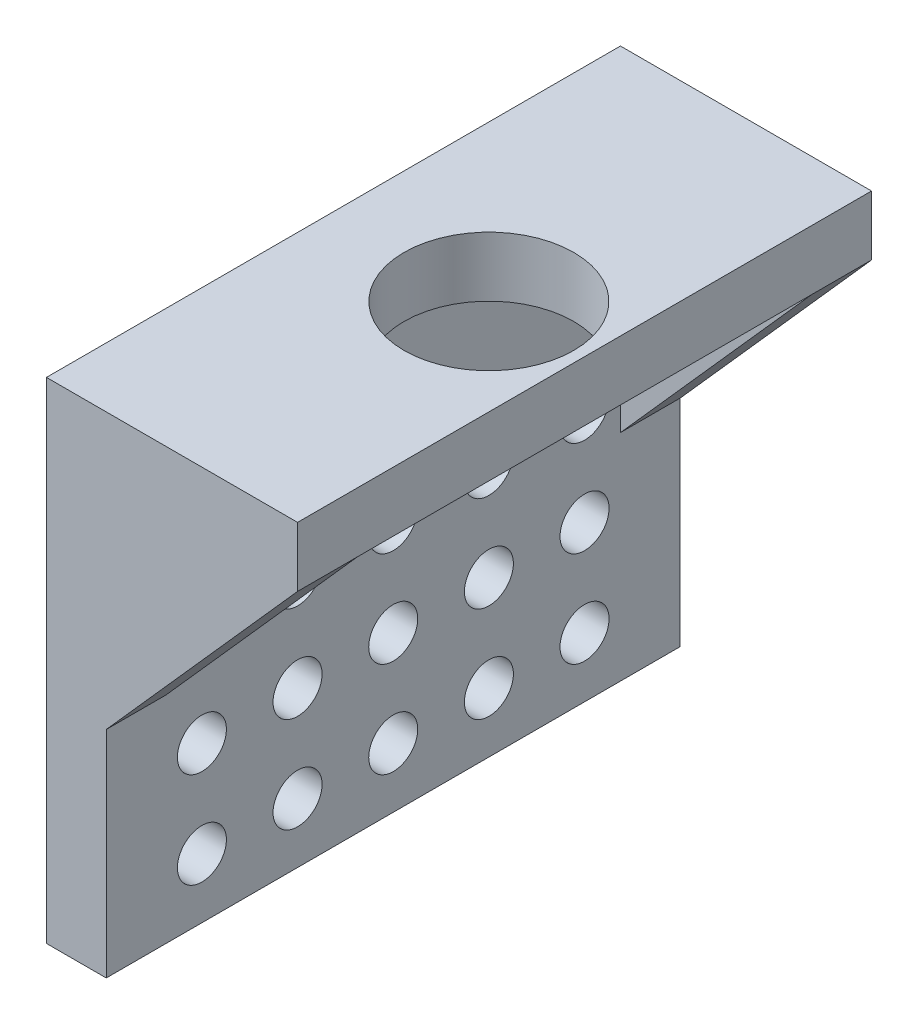
ISO-10303-21;
HEADER;
FILE_DESCRIPTION(('STEP AP214'),'2;1');
FILE_NAME('part.step','',(''),(''),'','','');
FILE_SCHEMA(('AUTOMOTIVE_DESIGN { 1 0 10303 214 1 1 1 1 }'));
ENDSEC;
DATA;
#1=APPLICATION_CONTEXT('core data for automotive mechanical design processes');
#2=APPLICATION_PROTOCOL_DEFINITION('international standard','automotive_design',2000,#1);
#3=PRODUCT_CONTEXT('',#1,'mechanical');
#4=PRODUCT('Part','Part','',(#3));
#5=PRODUCT_RELATED_PRODUCT_CATEGORY('part','',(#4));
#6=PRODUCT_DEFINITION_FORMATION('','',#4);
#7=PRODUCT_DEFINITION_CONTEXT('part definition',#1,'design');
#8=PRODUCT_DEFINITION('design','',#6,#7);
#9=PRODUCT_DEFINITION_SHAPE('','',#8);
#10=(LENGTH_UNIT() NAMED_UNIT(*) SI_UNIT(.MILLI.,.METRE.));
#11=(NAMED_UNIT(*) PLANE_ANGLE_UNIT() SI_UNIT($,.RADIAN.));
#12=(NAMED_UNIT(*) SI_UNIT($,.STERADIAN.) SOLID_ANGLE_UNIT());
#13=UNCERTAINTY_MEASURE_WITH_UNIT(LENGTH_MEASURE(1.E-05),#10,'distance_accuracy_value','');
#14=(GEOMETRIC_REPRESENTATION_CONTEXT(3) GLOBAL_UNCERTAINTY_ASSIGNED_CONTEXT((#13)) GLOBAL_UNIT_ASSIGNED_CONTEXT((#10,
#11,#12)) REPRESENTATION_CONTEXT('',''));
#15=CARTESIAN_POINT('',(0.,0.,0.));
#16=DIRECTION('',(0.,0.,1.));
#17=DIRECTION('',(1.,0.,0.));
#18=AXIS2_PLACEMENT_3D('',#15,#16,#17);
#19=CARTESIAN_POINT('',(0.,0.,0.));
#20=DIRECTION('',(0.,-1.,0.));
#21=DIRECTION('',(0.,0.,-1.));
#22=AXIS2_PLACEMENT_3D('',#19,#20,#21);
#23=PLANE('',#22);
#24=CARTESIAN_POINT('',(13.,0.,24.));
#25=DIRECTION('',(0.,1.,0.));
#26=DIRECTION('',(0.,0.,1.));
#27=AXIS2_PLACEMENT_3D('',#24,#25,#26);
#28=CIRCLE('',#27,7.1);
#29=CARTESIAN_POINT('',(13.,0.,31.1));
#30=VERTEX_POINT('',#29);
#31=EDGE_CURVE('E164',#30,#30,#28,.T.);
#32=ORIENTED_EDGE('',*,*,#31,.T.);
#33=EDGE_LOOP('',(#32));
#34=FACE_BOUND('',#33,.T.);
#35=DIRECTION('',(0.,0.,1.));
#36=VECTOR('',#35,1.);
#37=CARTESIAN_POINT('',(5.,0.,48.));
#38=LINE('',#37,#36);
#39=CARTESIAN_POINT('',(5.,0.,5.));
#40=VERTEX_POINT('',#39);
#41=CARTESIAN_POINT('',(5.,0.,43.));
#42=VERTEX_POINT('',#41);
#43=EDGE_CURVE('E63',#40,#42,#38,.T.);
#44=ORIENTED_EDGE('',*,*,#43,.F.);
#45=DIRECTION('',(-1.,0.,0.));
#46=VECTOR('',#45,1.);
#47=CARTESIAN_POINT('',(21.,0.,5.));
#48=LINE('',#47,#46);
#49=CARTESIAN_POINT('',(21.,0.,5.));
#50=VERTEX_POINT('',#49);
#51=EDGE_CURVE('E208',#50,#40,#48,.T.);
#52=ORIENTED_EDGE('',*,*,#51,.F.);
#53=DIRECTION('',(0.,0.,-1.));
#54=VECTOR('',#53,1.);
#55=CARTESIAN_POINT('',(21.,0.,0.));
#56=LINE('',#55,#54);
#57=CARTESIAN_POINT('',(21.,0.,43.));
#58=VERTEX_POINT('',#57);
#59=EDGE_CURVE('E135',#58,#50,#56,.T.);
#60=ORIENTED_EDGE('',*,*,#59,.F.);
#61=DIRECTION('',(1.,0.,0.));
#62=VECTOR('',#61,1.);
#63=CARTESIAN_POINT('',(21.,0.,43.));
#64=LINE('',#63,#62);
#65=EDGE_CURVE('E199',#42,#58,#64,.T.);
#66=ORIENTED_EDGE('',*,*,#65,.F.);
#67=EDGE_LOOP('',(#44,#52,#60,#66));
#68=FACE_BOUND('',#67,.T.);
#69=ADVANCED_FACE('F39',(#34,#68),#23,.T.);
#70=CARTESIAN_POINT('',(5.,-36.,48.));
#71=DIRECTION('',(-1.,0.,0.));
#72=DIRECTION('',(0.,0.,1.));
#73=AXIS2_PLACEMENT_3D('',#70,#71,#72);
#74=PLANE('',#73);
#75=CARTESIAN_POINT('',(5.00000000000001,-31.,16.));
#76=DIRECTION('',(-1.,0.,0.));
#77=DIRECTION('',(0.,0.,1.));
#78=AXIS2_PLACEMENT_3D('',#75,#76,#77);
#79=CIRCLE('',#78,2.05);
#80=CARTESIAN_POINT('',(5.00000000000001,-31.,18.05));
#81=VERTEX_POINT('',#80);
#82=EDGE_CURVE('E220',#81,#81,#79,.T.);
#83=ORIENTED_EDGE('',*,*,#82,.T.);
#84=EDGE_LOOP('',(#83));
#85=FACE_BOUND('',#84,.T.);
#86=CARTESIAN_POINT('',(5.,-31.,24.));
#87=DIRECTION('',(-1.,0.,0.));
#88=DIRECTION('',(0.,0.,1.));
#89=AXIS2_PLACEMENT_3D('',#86,#87,#88);
#90=CIRCLE('',#89,2.05);
#91=CARTESIAN_POINT('',(5.,-31.,26.05));
#92=VERTEX_POINT('',#91);
#93=EDGE_CURVE('E225',#92,#92,#90,.T.);
#94=ORIENTED_EDGE('',*,*,#93,.T.);
#95=EDGE_LOOP('',(#94));
#96=FACE_BOUND('',#95,.T.);
#97=CARTESIAN_POINT('',(5.,-31.,32.));
#98=DIRECTION('',(-1.,0.,0.));
#99=DIRECTION('',(0.,0.,1.));
#100=AXIS2_PLACEMENT_3D('',#97,#98,#99);
#101=CIRCLE('',#100,2.05);
#102=CARTESIAN_POINT('',(5.,-31.,34.05));
#103=VERTEX_POINT('',#102);
#104=EDGE_CURVE('E229',#103,#103,#101,.T.);
#105=ORIENTED_EDGE('',*,*,#104,.T.);
#106=EDGE_LOOP('',(#105));
#107=FACE_BOUND('',#106,.T.);
#108=CARTESIAN_POINT('',(5.,-31.,40.));
#109=DIRECTION('',(-1.,0.,0.));
#110=DIRECTION('',(0.,0.,1.));
#111=AXIS2_PLACEMENT_3D('',#108,#109,#110);
#112=CIRCLE('',#111,2.05);
#113=CARTESIAN_POINT('',(5.,-31.,42.05));
#114=VERTEX_POINT('',#113);
#115=EDGE_CURVE('E233',#114,#114,#112,.T.);
#116=ORIENTED_EDGE('',*,*,#115,.T.);
#117=EDGE_LOOP('',(#116));
#118=FACE_BOUND('',#117,.T.);
#119=CARTESIAN_POINT('',(5.00000000000001,-23.,16.));
#120=DIRECTION('',(-1.,0.,0.));
#121=DIRECTION('',(0.,0.,1.));
#122=AXIS2_PLACEMENT_3D('',#119,#120,#121);
#123=CIRCLE('',#122,2.05);
#124=CARTESIAN_POINT('',(5.00000000000001,-23.,18.05));
#125=VERTEX_POINT('',#124);
#126=EDGE_CURVE('E237',#125,#125,#123,.T.);
#127=ORIENTED_EDGE('',*,*,#126,.T.);
#128=EDGE_LOOP('',(#127));
#129=FACE_BOUND('',#128,.T.);
#130=CARTESIAN_POINT('',(5.,-23.,24.));
#131=DIRECTION('',(-1.,0.,0.));
#132=DIRECTION('',(0.,0.,1.));
#133=AXIS2_PLACEMENT_3D('',#130,#131,#132);
#134=CIRCLE('',#133,2.05);
#135=CARTESIAN_POINT('',(5.,-23.,26.05));
#136=VERTEX_POINT('',#135);
#137=EDGE_CURVE('E241',#136,#136,#134,.T.);
#138=ORIENTED_EDGE('',*,*,#137,.T.);
#139=EDGE_LOOP('',(#138));
#140=FACE_BOUND('',#139,.T.);
#141=CARTESIAN_POINT('',(5.,-23.,32.));
#142=DIRECTION('',(-1.,0.,0.));
#143=DIRECTION('',(0.,0.,1.));
#144=AXIS2_PLACEMENT_3D('',#141,#142,#143);
#145=CIRCLE('',#144,2.05);
#146=CARTESIAN_POINT('',(5.,-23.,34.05));
#147=VERTEX_POINT('',#146);
#148=EDGE_CURVE('E245',#147,#147,#145,.T.);
#149=ORIENTED_EDGE('',*,*,#148,.T.);
#150=EDGE_LOOP('',(#149));
#151=FACE_BOUND('',#150,.T.);
#152=CARTESIAN_POINT('',(5.,-23.,40.));
#153=DIRECTION('',(-1.,0.,0.));
#154=DIRECTION('',(0.,0.,1.));
#155=AXIS2_PLACEMENT_3D('',#152,#153,#154);
#156=CIRCLE('',#155,2.05);
#157=CARTESIAN_POINT('',(5.,-23.,42.05));
#158=VERTEX_POINT('',#157);
#159=EDGE_CURVE('E249',#158,#158,#156,.T.);
#160=ORIENTED_EDGE('',*,*,#159,.T.);
#161=EDGE_LOOP('',(#160));
#162=FACE_BOUND('',#161,.T.);
#163=CARTESIAN_POINT('',(5.00000000000001,-15.,16.));
#164=DIRECTION('',(-1.,0.,0.));
#165=DIRECTION('',(0.,0.,1.));
#166=AXIS2_PLACEMENT_3D('',#163,#164,#165);
#167=CIRCLE('',#166,2.05);
#168=CARTESIAN_POINT('',(5.00000000000001,-15.,18.05));
#169=VERTEX_POINT('',#168);
#170=EDGE_CURVE('E253',#169,#169,#167,.T.);
#171=ORIENTED_EDGE('',*,*,#170,.T.);
#172=EDGE_LOOP('',(#171));
#173=FACE_BOUND('',#172,.T.);
#174=CARTESIAN_POINT('',(5.,-15.,24.));
#175=DIRECTION('',(-1.,0.,0.));
#176=DIRECTION('',(0.,0.,1.));
#177=AXIS2_PLACEMENT_3D('',#174,#175,#176);
#178=CIRCLE('',#177,2.05);
#179=CARTESIAN_POINT('',(5.,-15.,26.05));
#180=VERTEX_POINT('',#179);
#181=EDGE_CURVE('E257',#180,#180,#178,.T.);
#182=ORIENTED_EDGE('',*,*,#181,.T.);
#183=EDGE_LOOP('',(#182));
#184=FACE_BOUND('',#183,.T.);
#185=CARTESIAN_POINT('',(5.,-15.,32.));
#186=DIRECTION('',(-1.,0.,0.));
#187=DIRECTION('',(0.,0.,1.));
#188=AXIS2_PLACEMENT_3D('',#185,#186,#187);
#189=CIRCLE('',#188,2.05);
#190=CARTESIAN_POINT('',(5.,-15.,34.05));
#191=VERTEX_POINT('',#190);
#192=EDGE_CURVE('E261',#191,#191,#189,.T.);
#193=ORIENTED_EDGE('',*,*,#192,.T.);
#194=EDGE_LOOP('',(#193));
#195=FACE_BOUND('',#194,.T.);
#196=CARTESIAN_POINT('',(5.,-15.,40.));
#197=DIRECTION('',(-1.,0.,0.));
#198=DIRECTION('',(0.,0.,1.));
#199=AXIS2_PLACEMENT_3D('',#196,#197,#198);
#200=CIRCLE('',#199,2.05);
#201=CARTESIAN_POINT('',(5.,-15.,42.05));
#202=VERTEX_POINT('',#201);
#203=EDGE_CURVE('E265',#202,#202,#200,.T.);
#204=ORIENTED_EDGE('',*,*,#203,.T.);
#205=EDGE_LOOP('',(#204));
#206=FACE_BOUND('',#205,.T.);
#207=CARTESIAN_POINT('',(5.00000000000001,-23.,7.99999999999998));
#208=DIRECTION('',(-1.,0.,0.));
#209=DIRECTION('',(0.,0.,1.));
#210=AXIS2_PLACEMENT_3D('',#207,#208,#209);
#211=CIRCLE('',#210,2.05);
#212=CARTESIAN_POINT('',(5.00000000000001,-23.,10.05));
#213=VERTEX_POINT('',#212);
#214=EDGE_CURVE('E269',#213,#213,#211,.T.);
#215=ORIENTED_EDGE('',*,*,#214,.T.);
#216=EDGE_LOOP('',(#215));
#217=FACE_BOUND('',#216,.T.);
#218=CARTESIAN_POINT('',(5.00000000000001,-15.,7.99999999999995));
#219=DIRECTION('',(-1.,0.,0.));
#220=DIRECTION('',(0.,0.,1.));
#221=AXIS2_PLACEMENT_3D('',#218,#219,#220);
#222=CIRCLE('',#221,2.05);
#223=CARTESIAN_POINT('',(5.00000000000001,-15.,10.05));
#224=VERTEX_POINT('',#223);
#225=EDGE_CURVE('E273',#224,#224,#222,.T.);
#226=ORIENTED_EDGE('',*,*,#225,.T.);
#227=EDGE_LOOP('',(#226));
#228=FACE_BOUND('',#227,.T.);
#229=CARTESIAN_POINT('',(5.00000000000001,-31.,8.00000000000001));
#230=DIRECTION('',(-1.,0.,0.));
#231=DIRECTION('',(0.,0.,1.));
#232=AXIS2_PLACEMENT_3D('',#229,#230,#231);
#233=CIRCLE('',#232,2.05);
#234=CARTESIAN_POINT('',(5.00000000000001,-31.,10.05));
#235=VERTEX_POINT('',#234);
#236=EDGE_CURVE('E277',#235,#235,#233,.T.);
#237=ORIENTED_EDGE('',*,*,#236,.T.);
#238=EDGE_LOOP('',(#237));
#239=FACE_BOUND('',#238,.T.);
#240=DIRECTION('',(0.,1.,0.));
#241=VECTOR('',#240,1.);
#242=CARTESIAN_POINT('',(5.,-18.,43.));
#243=LINE('',#242,#241);
#244=CARTESIAN_POINT('',(5.,-18.,43.));
#245=VERTEX_POINT('',#244);
#246=EDGE_CURVE('E182',#245,#42,#243,.T.);
#247=ORIENTED_EDGE('',*,*,#246,.F.);
#248=DIRECTION('',(0.,0.,-1.));
#249=VECTOR('',#248,1.);
#250=CARTESIAN_POINT('',(5.,-18.,43.));
#251=LINE('',#250,#249);
#252=CARTESIAN_POINT('',(5.,-18.,48.));
#253=VERTEX_POINT('',#252);
#254=EDGE_CURVE('E198',#253,#245,#251,.T.);
#255=ORIENTED_EDGE('',*,*,#254,.F.);
#256=DIRECTION('',(0.,1.,0.));
#257=VECTOR('',#256,1.);
#258=CARTESIAN_POINT('',(5.,-36.,48.));
#259=LINE('',#258,#257);
#260=CARTESIAN_POINT('',(5.,-36.,48.));
#261=VERTEX_POINT('',#260);
#262=EDGE_CURVE('E174',#261,#253,#259,.T.);
#263=ORIENTED_EDGE('',*,*,#262,.F.);
#264=DIRECTION('',(0.,0.,1.));
#265=VECTOR('',#264,1.);
#266=CARTESIAN_POINT('',(5.,-36.,48.));
#267=LINE('',#266,#265);
#268=CARTESIAN_POINT('',(5.00000000000001,-36.,0.));
#269=VERTEX_POINT('',#268);
#270=EDGE_CURVE('E186',#269,#261,#267,.T.);
#271=ORIENTED_EDGE('',*,*,#270,.F.);
#272=DIRECTION('',(0.,1.,0.));
#273=VECTOR('',#272,1.);
#274=CARTESIAN_POINT('',(5.00000000000001,-36.,0.));
#275=LINE('',#274,#273);
#276=CARTESIAN_POINT('',(5.,-18.,0.));
#277=VERTEX_POINT('',#276);
#278=EDGE_CURVE('E168',#269,#277,#275,.T.);
#279=ORIENTED_EDGE('',*,*,#278,.T.);
#280=DIRECTION('',(0.,0.,-1.));
#281=VECTOR('',#280,1.);
#282=CARTESIAN_POINT('',(5.,-18.,5.));
#283=LINE('',#282,#281);
#284=CARTESIAN_POINT('',(5.,-18.,5.));
#285=VERTEX_POINT('',#284);
#286=EDGE_CURVE('E117',#285,#277,#283,.T.);
#287=ORIENTED_EDGE('',*,*,#286,.F.);
#288=DIRECTION('',(0.,1.,0.));
#289=VECTOR('',#288,1.);
#290=CARTESIAN_POINT('',(5.,-18.,5.));
#291=LINE('',#290,#289);
#292=EDGE_CURVE('E203',#285,#40,#291,.T.);
#293=ORIENTED_EDGE('',*,*,#292,.T.);
#294=ORIENTED_EDGE('',*,*,#43,.T.);
#295=EDGE_LOOP('',(#247,#255,#263,#271,#279,#287,#293,#294));
#296=FACE_BOUND('',#295,.T.);
#297=ADVANCED_FACE('F380',(#85,#96,#107,#118,#129,#140,#151,#162,#173,#184,#195,#206,#217,#228,
#239,#296),#74,.F.);
#298=CARTESIAN_POINT('',(0.,5.,0.));
#299=DIRECTION('',(0.,-1.,0.));
#300=DIRECTION('',(0.,0.,-1.));
#301=AXIS2_PLACEMENT_3D('',#298,#299,#300);
#302=PLANE('',#301);
#303=DIRECTION('',(0.,0.,1.));
#304=VECTOR('',#303,1.);
#305=CARTESIAN_POINT('',(0.,5.,48.));
#306=LINE('',#305,#304);
#307=CARTESIAN_POINT('',(0.,5.,0.));
#308=VERTEX_POINT('',#307);
#309=CARTESIAN_POINT('',(0.,5.,48.));
#310=VERTEX_POINT('',#309);
#311=EDGE_CURVE('E151',#308,#310,#306,.T.);
#312=ORIENTED_EDGE('',*,*,#311,.T.);
#313=DIRECTION('',(1.,0.,0.));
#314=VECTOR('',#313,1.);
#315=CARTESIAN_POINT('',(21.,5.,48.));
#316=LINE('',#315,#314);
#317=CARTESIAN_POINT('',(21.,5.,48.));
#318=VERTEX_POINT('',#317);
#319=EDGE_CURVE('E158',#310,#318,#316,.T.);
#320=ORIENTED_EDGE('',*,*,#319,.T.);
#321=DIRECTION('',(0.,0.,-1.));
#322=VECTOR('',#321,1.);
#323=CARTESIAN_POINT('',(21.,5.,0.));
#324=LINE('',#323,#322);
#325=CARTESIAN_POINT('',(21.,5.,0.));
#326=VERTEX_POINT('',#325);
#327=EDGE_CURVE('E155',#318,#326,#324,.T.);
#328=ORIENTED_EDGE('',*,*,#327,.T.);
#329=DIRECTION('',(-1.,0.,0.));
#330=VECTOR('',#329,1.);
#331=CARTESIAN_POINT('',(0.,5.,0.));
#332=LINE('',#331,#330);
#333=EDGE_CURVE('E141',#326,#308,#332,.T.);
#334=ORIENTED_EDGE('',*,*,#333,.T.);
#335=EDGE_LOOP('',(#312,#320,#328,#334));
#336=FACE_BOUND('',#335,.T.);
#337=CARTESIAN_POINT('',(13.,5.,24.));
#338=DIRECTION('',(0.,1.,0.));
#339=DIRECTION('',(0.,0.,1.));
#340=AXIS2_PLACEMENT_3D('',#337,#338,#339);
#341=CIRCLE('',#340,7.1);
#342=CARTESIAN_POINT('',(13.,5.,31.1));
#343=VERTEX_POINT('',#342);
#344=EDGE_CURVE('E152',#343,#343,#341,.T.);
#345=ORIENTED_EDGE('',*,*,#344,.F.);
#346=EDGE_LOOP('',(#345));
#347=FACE_BOUND('',#346,.T.);
#348=ADVANCED_FACE('F348',(#336,#347),#302,.F.);
#349=CARTESIAN_POINT('',(0.,5.,48.));
#350=DIRECTION('',(1.,0.,0.));
#351=DIRECTION('',(0.,0.,-1.));
#352=AXIS2_PLACEMENT_3D('',#349,#350,#351);
#353=PLANE('',#352);
#354=CARTESIAN_POINT('',(0.,-31.,16.));
#355=DIRECTION('',(-1.,0.,0.));
#356=DIRECTION('',(0.,0.,1.));
#357=AXIS2_PLACEMENT_3D('',#354,#355,#356);
#358=CIRCLE('',#357,2.05);
#359=CARTESIAN_POINT('',(0.,-31.,18.05));
#360=VERTEX_POINT('',#359);
#361=EDGE_CURVE('E285',#360,#360,#358,.T.);
#362=ORIENTED_EDGE('',*,*,#361,.F.);
#363=EDGE_LOOP('',(#362));
#364=FACE_BOUND('',#363,.T.);
#365=CARTESIAN_POINT('',(0.,-31.,24.));
#366=DIRECTION('',(-1.,0.,0.));
#367=DIRECTION('',(0.,0.,1.));
#368=AXIS2_PLACEMENT_3D('',#365,#366,#367);
#369=CIRCLE('',#368,2.05);
#370=CARTESIAN_POINT('',(0.,-31.,26.05));
#371=VERTEX_POINT('',#370);
#372=EDGE_CURVE('E311',#371,#371,#369,.T.);
#373=ORIENTED_EDGE('',*,*,#372,.F.);
#374=EDGE_LOOP('',(#373));
#375=FACE_BOUND('',#374,.T.);
#376=CARTESIAN_POINT('',(0.,-31.,32.));
#377=DIRECTION('',(-1.,0.,0.));
#378=DIRECTION('',(0.,0.,1.));
#379=AXIS2_PLACEMENT_3D('',#376,#377,#378);
#380=CIRCLE('',#379,2.05);
#381=CARTESIAN_POINT('',(0.,-31.,34.05));
#382=VERTEX_POINT('',#381);
#383=EDGE_CURVE('E307',#382,#382,#380,.T.);
#384=ORIENTED_EDGE('',*,*,#383,.F.);
#385=EDGE_LOOP('',(#384));
#386=FACE_BOUND('',#385,.T.);
#387=CARTESIAN_POINT('',(0.,-31.,40.));
#388=DIRECTION('',(-1.,0.,0.));
#389=DIRECTION('',(0.,0.,1.));
#390=AXIS2_PLACEMENT_3D('',#387,#388,#389);
#391=CIRCLE('',#390,2.05);
#392=CARTESIAN_POINT('',(0.,-31.,42.05));
#393=VERTEX_POINT('',#392);
#394=EDGE_CURVE('E303',#393,#393,#391,.T.);
#395=ORIENTED_EDGE('',*,*,#394,.F.);
#396=EDGE_LOOP('',(#395));
#397=FACE_BOUND('',#396,.T.);
#398=CARTESIAN_POINT('',(0.,-23.,16.));
#399=DIRECTION('',(-1.,0.,0.));
#400=DIRECTION('',(0.,0.,1.));
#401=AXIS2_PLACEMENT_3D('',#398,#399,#400);
#402=CIRCLE('',#401,2.05);
#403=CARTESIAN_POINT('',(0.,-23.,18.05));
#404=VERTEX_POINT('',#403);
#405=EDGE_CURVE('E299',#404,#404,#402,.T.);
#406=ORIENTED_EDGE('',*,*,#405,.F.);
#407=EDGE_LOOP('',(#406));
#408=FACE_BOUND('',#407,.T.);
#409=CARTESIAN_POINT('',(0.,-23.,24.));
#410=DIRECTION('',(-1.,0.,0.));
#411=DIRECTION('',(0.,0.,1.));
#412=AXIS2_PLACEMENT_3D('',#409,#410,#411);
#413=CIRCLE('',#412,2.05);
#414=CARTESIAN_POINT('',(0.,-23.,26.05));
#415=VERTEX_POINT('',#414);
#416=EDGE_CURVE('E295',#415,#415,#413,.T.);
#417=ORIENTED_EDGE('',*,*,#416,.F.);
#418=EDGE_LOOP('',(#417));
#419=FACE_BOUND('',#418,.T.);
#420=CARTESIAN_POINT('',(0.,-23.,32.));
#421=DIRECTION('',(-1.,0.,0.));
#422=DIRECTION('',(0.,0.,1.));
#423=AXIS2_PLACEMENT_3D('',#420,#421,#422);
#424=CIRCLE('',#423,2.05);
#425=CARTESIAN_POINT('',(0.,-23.,34.05));
#426=VERTEX_POINT('',#425);
#427=EDGE_CURVE('E290',#426,#426,#424,.T.);
#428=ORIENTED_EDGE('',*,*,#427,.F.);
#429=EDGE_LOOP('',(#428));
#430=FACE_BOUND('',#429,.T.);
#431=CARTESIAN_POINT('',(0.,-23.,40.));
#432=DIRECTION('',(-1.,0.,0.));
#433=DIRECTION('',(0.,0.,1.));
#434=AXIS2_PLACEMENT_3D('',#431,#432,#433);
#435=CIRCLE('',#434,2.05);
#436=CARTESIAN_POINT('',(0.,-23.,42.05));
#437=VERTEX_POINT('',#436);
#438=EDGE_CURVE('E286',#437,#437,#435,.T.);
#439=ORIENTED_EDGE('',*,*,#438,.F.);
#440=EDGE_LOOP('',(#439));
#441=FACE_BOUND('',#440,.T.);
#442=CARTESIAN_POINT('',(0.,-15.,16.));
#443=DIRECTION('',(-1.,0.,0.));
#444=DIRECTION('',(0.,0.,1.));
#445=AXIS2_PLACEMENT_3D('',#442,#443,#444);
#446=CIRCLE('',#445,2.05);
#447=CARTESIAN_POINT('',(0.,-15.,18.05));
#448=VERTEX_POINT('',#447);
#449=EDGE_CURVE('E291',#448,#448,#446,.T.);
#450=ORIENTED_EDGE('',*,*,#449,.F.);
#451=EDGE_LOOP('',(#450));
#452=FACE_BOUND('',#451,.T.);
#453=CARTESIAN_POINT('',(0.,-15.,24.));
#454=DIRECTION('',(-1.,0.,0.));
#455=DIRECTION('',(0.,0.,1.));
#456=AXIS2_PLACEMENT_3D('',#453,#454,#455);
#457=CIRCLE('',#456,2.05);
#458=CARTESIAN_POINT('',(0.,-15.,26.05));
#459=VERTEX_POINT('',#458);
#460=EDGE_CURVE('E334',#459,#459,#457,.T.);
#461=ORIENTED_EDGE('',*,*,#460,.F.);
#462=EDGE_LOOP('',(#461));
#463=FACE_BOUND('',#462,.T.);
#464=CARTESIAN_POINT('',(0.,-15.,32.));
#465=DIRECTION('',(-1.,0.,0.));
#466=DIRECTION('',(0.,0.,1.));
#467=AXIS2_PLACEMENT_3D('',#464,#465,#466);
#468=CIRCLE('',#467,2.05);
#469=CARTESIAN_POINT('',(0.,-15.,34.05));
#470=VERTEX_POINT('',#469);
#471=EDGE_CURVE('E330',#470,#470,#468,.T.);
#472=ORIENTED_EDGE('',*,*,#471,.F.);
#473=EDGE_LOOP('',(#472));
#474=FACE_BOUND('',#473,.T.);
#475=CARTESIAN_POINT('',(0.,-15.,40.));
#476=DIRECTION('',(-1.,0.,0.));
#477=DIRECTION('',(0.,0.,1.));
#478=AXIS2_PLACEMENT_3D('',#475,#476,#477);
#479=CIRCLE('',#478,2.05);
#480=CARTESIAN_POINT('',(0.,-15.,42.05));
#481=VERTEX_POINT('',#480);
#482=EDGE_CURVE('E326',#481,#481,#479,.T.);
#483=ORIENTED_EDGE('',*,*,#482,.F.);
#484=EDGE_LOOP('',(#483));
#485=FACE_BOUND('',#484,.T.);
#486=CARTESIAN_POINT('',(0.,-23.,7.99999999999998));
#487=DIRECTION('',(-1.,0.,0.));
#488=DIRECTION('',(0.,0.,1.));
#489=AXIS2_PLACEMENT_3D('',#486,#487,#488);
#490=CIRCLE('',#489,2.05);
#491=CARTESIAN_POINT('',(0.,-23.,10.05));
#492=VERTEX_POINT('',#491);
#493=EDGE_CURVE('E322',#492,#492,#490,.T.);
#494=ORIENTED_EDGE('',*,*,#493,.F.);
#495=EDGE_LOOP('',(#494));
#496=FACE_BOUND('',#495,.T.);
#497=CARTESIAN_POINT('',(0.,-15.,7.99999999999995));
#498=DIRECTION('',(-1.,0.,0.));
#499=DIRECTION('',(0.,0.,1.));
#500=AXIS2_PLACEMENT_3D('',#497,#498,#499);
#501=CIRCLE('',#500,2.05);
#502=CARTESIAN_POINT('',(0.,-15.,10.05));
#503=VERTEX_POINT('',#502);
#504=EDGE_CURVE('E318',#503,#503,#501,.T.);
#505=ORIENTED_EDGE('',*,*,#504,.F.);
#506=EDGE_LOOP('',(#505));
#507=FACE_BOUND('',#506,.T.);
#508=CARTESIAN_POINT('',(0.,-31.,8.00000000000001));
#509=DIRECTION('',(-1.,0.,0.));
#510=DIRECTION('',(0.,0.,1.));
#511=AXIS2_PLACEMENT_3D('',#508,#509,#510);
#512=CIRCLE('',#511,2.05);
#513=CARTESIAN_POINT('',(0.,-31.,10.05));
#514=VERTEX_POINT('',#513);
#515=EDGE_CURVE('E281',#514,#514,#512,.T.);
#516=ORIENTED_EDGE('',*,*,#515,.F.);
#517=EDGE_LOOP('',(#516));
#518=FACE_BOUND('',#517,.T.);
#519=DIRECTION('',(0.,-1.,0.));
#520=VECTOR('',#519,1.);
#521=CARTESIAN_POINT('',(0.,5.,0.));
#522=LINE('',#521,#520);
#523=CARTESIAN_POINT('',(0.,-36.,0.));
#524=VERTEX_POINT('',#523);
#525=EDGE_CURVE('E143',#308,#524,#522,.T.);
#526=ORIENTED_EDGE('',*,*,#525,.T.);
#527=DIRECTION('',(0.,0.,-1.));
#528=VECTOR('',#527,1.);
#529=CARTESIAN_POINT('',(0.,-36.,0.));
#530=LINE('',#529,#528);
#531=CARTESIAN_POINT('',(0.,-36.,48.));
#532=VERTEX_POINT('',#531);
#533=EDGE_CURVE('E181',#532,#524,#530,.T.);
#534=ORIENTED_EDGE('',*,*,#533,.F.);
#535=DIRECTION('',(0.,-1.,0.));
#536=VECTOR('',#535,1.);
#537=CARTESIAN_POINT('',(0.,5.,48.));
#538=LINE('',#537,#536);
#539=EDGE_CURVE('E11',#310,#532,#538,.T.);
#540=ORIENTED_EDGE('',*,*,#539,.F.);
#541=ORIENTED_EDGE('',*,*,#311,.F.);
#542=EDGE_LOOP('',(#526,#534,#540,#541));
#543=FACE_BOUND('',#542,.T.);
#544=ADVANCED_FACE('F41',(#364,#375,#386,#397,#408,#419,#430,#441,#452,#463,#474,#485,#496,#507,
#518,#543),#353,.F.);
#545=CARTESIAN_POINT('',(21.,5.,48.));
#546=DIRECTION('',(0.,0.,-1.));
#547=DIRECTION('',(-1.,0.,0.));
#548=AXIS2_PLACEMENT_3D('',#545,#546,#547);
#549=PLANE('',#548);
#550=ORIENTED_EDGE('',*,*,#262,.T.);
#551=DIRECTION('',(-0.66436383882992,-0.747409318683659,0.));
#552=VECTOR('',#551,1.);
#553=CARTESIAN_POINT('',(21.,0.,48.));
#554=LINE('',#553,#552);
#555=CARTESIAN_POINT('',(21.,0.,48.));
#556=VERTEX_POINT('',#555);
#557=EDGE_CURVE('E55',#556,#253,#554,.T.);
#558=ORIENTED_EDGE('',*,*,#557,.F.);
#559=DIRECTION('',(0.,-1.,0.));
#560=VECTOR('',#559,1.);
#561=CARTESIAN_POINT('',(21.,5.,48.));
#562=LINE('',#561,#560);
#563=EDGE_CURVE('E48',#318,#556,#562,.T.);
#564=ORIENTED_EDGE('',*,*,#563,.F.);
#565=ORIENTED_EDGE('',*,*,#319,.F.);
#566=ORIENTED_EDGE('',*,*,#539,.T.);
#567=DIRECTION('',(-1.,0.,0.));
#568=VECTOR('',#567,1.);
#569=CARTESIAN_POINT('',(0.,-36.,48.));
#570=LINE('',#569,#568);
#571=EDGE_CURVE('E178',#261,#532,#570,.T.);
#572=ORIENTED_EDGE('',*,*,#571,.F.);
#573=EDGE_LOOP('',(#550,#558,#564,#565,#566,#572));
#574=FACE_BOUND('',#573,.T.);
#575=ADVANCED_FACE('F347',(#574),#549,.F.);
#576=CARTESIAN_POINT('',(21.,5.,0.));
#577=DIRECTION('',(-1.,0.,0.));
#578=DIRECTION('',(0.,0.,1.));
#579=AXIS2_PLACEMENT_3D('',#576,#577,#578);
#580=PLANE('',#579);
#581=ORIENTED_EDGE('',*,*,#563,.T.);
#582=DIRECTION('',(0.,0.,1.));
#583=VECTOR('',#582,1.);
#584=CARTESIAN_POINT('',(21.,0.,0.));
#585=LINE('',#584,#583);
#586=EDGE_CURVE('E123',#58,#556,#585,.T.);
#587=ORIENTED_EDGE('',*,*,#586,.F.);
#588=ORIENTED_EDGE('',*,*,#59,.T.);
#589=CARTESIAN_POINT('',(21.,0.,0.));
#590=VERTEX_POINT('',#589);
#591=EDGE_CURVE('E114',#590,#50,#585,.T.);
#592=ORIENTED_EDGE('',*,*,#591,.F.);
#593=DIRECTION('',(0.,-1.,0.));
#594=VECTOR('',#593,1.);
#595=CARTESIAN_POINT('',(21.,5.,0.));
#596=LINE('',#595,#594);
#597=EDGE_CURVE('E131',#326,#590,#596,.T.);
#598=ORIENTED_EDGE('',*,*,#597,.F.);
#599=ORIENTED_EDGE('',*,*,#327,.F.);
#600=EDGE_LOOP('',(#581,#587,#588,#592,#598,#599));
#601=FACE_BOUND('',#600,.T.);
#602=ADVANCED_FACE('F129',(#601),#580,.F.);
#603=CARTESIAN_POINT('',(0.,5.,0.));
#604=DIRECTION('',(0.,0.,1.));
#605=DIRECTION('',(1.,0.,0.));
#606=AXIS2_PLACEMENT_3D('',#603,#604,#605);
#607=PLANE('',#606);
#608=ORIENTED_EDGE('',*,*,#597,.T.);
#609=DIRECTION('',(-0.66436383882992,-0.747409318683659,0.));
#610=VECTOR('',#609,1.);
#611=CARTESIAN_POINT('',(21.,0.,0.));
#612=LINE('',#611,#610);
#613=EDGE_CURVE('E111',#590,#277,#612,.T.);
#614=ORIENTED_EDGE('',*,*,#613,.T.);
#615=ORIENTED_EDGE('',*,*,#278,.F.);
#616=DIRECTION('',(1.,0.,0.));
#617=VECTOR('',#616,1.);
#618=CARTESIAN_POINT('',(5.00000000000001,-36.,0.));
#619=LINE('',#618,#617);
#620=EDGE_CURVE('E189',#524,#269,#619,.T.);
#621=ORIENTED_EDGE('',*,*,#620,.F.);
#622=ORIENTED_EDGE('',*,*,#525,.F.);
#623=ORIENTED_EDGE('',*,*,#333,.F.);
#624=EDGE_LOOP('',(#608,#614,#615,#621,#622,#623));
#625=FACE_BOUND('',#624,.T.);
#626=ADVANCED_FACE('F139',(#625),#607,.F.);
#627=CARTESIAN_POINT('',(13.,5.,24.));
#628=DIRECTION('',(0.,-1.,0.));
#629=DIRECTION('',(0.,0.,-1.));
#630=AXIS2_PLACEMENT_3D('',#627,#628,#629);
#631=CYLINDRICAL_SURFACE('',#630,7.1);
#632=ORIENTED_EDGE('',*,*,#344,.T.);
#633=EDGE_LOOP('',(#632));
#634=FACE_BOUND('',#633,.T.);
#635=ORIENTED_EDGE('',*,*,#31,.F.);
#636=EDGE_LOOP('',(#635));
#637=FACE_BOUND('',#636,.T.);
#638=ADVANCED_FACE('F407',(#634,#637),#631,.F.);
#639=CARTESIAN_POINT('',(0.,-36.,0.));
#640=DIRECTION('',(0.,1.,0.));
#641=DIRECTION('',(0.,0.,1.));
#642=AXIS2_PLACEMENT_3D('',#639,#640,#641);
#643=PLANE('',#642);
#644=ORIENTED_EDGE('',*,*,#533,.T.);
#645=ORIENTED_EDGE('',*,*,#620,.T.);
#646=ORIENTED_EDGE('',*,*,#270,.T.);
#647=ORIENTED_EDGE('',*,*,#571,.T.);
#648=EDGE_LOOP('',(#644,#645,#646,#647));
#649=FACE_BOUND('',#648,.T.);
#650=ADVANCED_FACE('F368',(#649),#643,.F.);
#651=CARTESIAN_POINT('',(21.,-18.,43.));
#652=DIRECTION('',(0.,0.,1.));
#653=DIRECTION('',(1.,0.,0.));
#654=AXIS2_PLACEMENT_3D('',#651,#652,#653);
#655=PLANE('',#654);
#656=ORIENTED_EDGE('',*,*,#65,.T.);
#657=DIRECTION('',(-0.66436383882992,-0.74740931868366,0.));
#658=VECTOR('',#657,1.);
#659=CARTESIAN_POINT('',(12.0620689655173,-10.0551724137931,43.));
#660=LINE('',#659,#658);
#661=EDGE_CURVE('E211',#58,#245,#660,.T.);
#662=ORIENTED_EDGE('',*,*,#661,.T.);
#663=ORIENTED_EDGE('',*,*,#246,.T.);
#664=EDGE_LOOP('',(#656,#662,#663));
#665=FACE_BOUND('',#664,.T.);
#666=ADVANCED_FACE('F379',(#665),#655,.F.);
#667=CARTESIAN_POINT('',(21.,-18.,5.));
#668=DIRECTION('',(0.,0.,-1.));
#669=DIRECTION('',(-1.,0.,0.));
#670=AXIS2_PLACEMENT_3D('',#667,#668,#669);
#671=PLANE('',#670);
#672=ORIENTED_EDGE('',*,*,#292,.F.);
#673=DIRECTION('',(0.66436383882992,0.74740931868366,0.));
#674=VECTOR('',#673,1.);
#675=CARTESIAN_POINT('',(12.0620689655173,-10.0551724137931,5.));
#676=LINE('',#675,#674);
#677=EDGE_CURVE('E137',#285,#50,#676,.T.);
#678=ORIENTED_EDGE('',*,*,#677,.T.);
#679=ORIENTED_EDGE('',*,*,#51,.T.);
#680=EDGE_LOOP('',(#672,#678,#679));
#681=FACE_BOUND('',#680,.T.);
#682=ADVANCED_FACE('F392',(#681),#671,.F.);
#683=CARTESIAN_POINT('',(21.,0.,0.));
#684=DIRECTION('',(-0.747409318683659,0.66436383882992,0.));
#685=DIRECTION('',(-0.66436383882992,-0.74740931868366,0.));
#686=AXIS2_PLACEMENT_3D('',#683,#684,#685);
#687=PLANE('',#686);
#688=ORIENTED_EDGE('',*,*,#286,.T.);
#689=ORIENTED_EDGE('',*,*,#613,.F.);
#690=ORIENTED_EDGE('',*,*,#591,.T.);
#691=ORIENTED_EDGE('',*,*,#677,.F.);
#692=EDGE_LOOP('',(#688,#689,#690,#691));
#693=FACE_BOUND('',#692,.T.);
#694=ADVANCED_FACE('F113',(#693),#687,.F.);
#695=ORIENTED_EDGE('',*,*,#586,.T.);
#696=ORIENTED_EDGE('',*,*,#557,.T.);
#697=ORIENTED_EDGE('',*,*,#254,.T.);
#698=ORIENTED_EDGE('',*,*,#661,.F.);
#699=EDGE_LOOP('',(#695,#696,#697,#698));
#700=FACE_BOUND('',#699,.T.);
#701=ADVANCED_FACE('F381',(#700),#687,.F.);
#702=CARTESIAN_POINT('',(18.,-31.,8.00000000000001));
#703=DIRECTION('',(-1.,0.,0.));
#704=DIRECTION('',(0.,0.,1.));
#705=AXIS2_PLACEMENT_3D('',#702,#703,#704);
#706=CYLINDRICAL_SURFACE('',#705,2.05);
#707=ORIENTED_EDGE('',*,*,#515,.T.);
#708=EDGE_LOOP('',(#707));
#709=FACE_BOUND('',#708,.T.);
#710=ORIENTED_EDGE('',*,*,#236,.F.);
#711=EDGE_LOOP('',(#710));
#712=FACE_BOUND('',#711,.T.);
#713=ADVANCED_FACE('F383',(#709,#712),#706,.F.);
#714=CARTESIAN_POINT('',(18.,-15.,7.99999999999995));
#715=DIRECTION('',(-1.,0.,0.));
#716=DIRECTION('',(0.,0.,1.));
#717=AXIS2_PLACEMENT_3D('',#714,#715,#716);
#718=CYLINDRICAL_SURFACE('',#717,2.05);
#719=ORIENTED_EDGE('',*,*,#504,.T.);
#720=EDGE_LOOP('',(#719));
#721=FACE_BOUND('',#720,.T.);
#722=ORIENTED_EDGE('',*,*,#225,.F.);
#723=EDGE_LOOP('',(#722));
#724=FACE_BOUND('',#723,.T.);
#725=ADVANCED_FACE('F389',(#721,#724),#718,.F.);
#726=CARTESIAN_POINT('',(18.,-23.,7.99999999999998));
#727=DIRECTION('',(-1.,0.,0.));
#728=DIRECTION('',(0.,0.,1.));
#729=AXIS2_PLACEMENT_3D('',#726,#727,#728);
#730=CYLINDRICAL_SURFACE('',#729,2.05);
#731=ORIENTED_EDGE('',*,*,#493,.T.);
#732=EDGE_LOOP('',(#731));
#733=FACE_BOUND('',#732,.T.);
#734=ORIENTED_EDGE('',*,*,#214,.F.);
#735=EDGE_LOOP('',(#734));
#736=FACE_BOUND('',#735,.T.);
#737=ADVANCED_FACE('F484',(#733,#736),#730,.F.);
#738=CARTESIAN_POINT('',(18.,-15.,40.));
#739=DIRECTION('',(-1.,0.,0.));
#740=DIRECTION('',(0.,0.,1.));
#741=AXIS2_PLACEMENT_3D('',#738,#739,#740);
#742=CYLINDRICAL_SURFACE('',#741,2.05);
#743=ORIENTED_EDGE('',*,*,#482,.T.);
#744=EDGE_LOOP('',(#743));
#745=FACE_BOUND('',#744,.T.);
#746=ORIENTED_EDGE('',*,*,#203,.F.);
#747=EDGE_LOOP('',(#746));
#748=FACE_BOUND('',#747,.T.);
#749=ADVANCED_FACE('F494',(#745,#748),#742,.F.);
#750=CARTESIAN_POINT('',(18.,-15.,32.));
#751=DIRECTION('',(-1.,0.,0.));
#752=DIRECTION('',(0.,0.,1.));
#753=AXIS2_PLACEMENT_3D('',#750,#751,#752);
#754=CYLINDRICAL_SURFACE('',#753,2.05);
#755=ORIENTED_EDGE('',*,*,#471,.T.);
#756=EDGE_LOOP('',(#755));
#757=FACE_BOUND('',#756,.T.);
#758=ORIENTED_EDGE('',*,*,#192,.F.);
#759=EDGE_LOOP('',(#758));
#760=FACE_BOUND('',#759,.T.);
#761=ADVANCED_FACE('F504',(#757,#760),#754,.F.);
#762=CARTESIAN_POINT('',(18.,-15.,24.));
#763=DIRECTION('',(-1.,0.,0.));
#764=DIRECTION('',(0.,0.,1.));
#765=AXIS2_PLACEMENT_3D('',#762,#763,#764);
#766=CYLINDRICAL_SURFACE('',#765,2.05);
#767=ORIENTED_EDGE('',*,*,#460,.T.);
#768=EDGE_LOOP('',(#767));
#769=FACE_BOUND('',#768,.T.);
#770=ORIENTED_EDGE('',*,*,#181,.F.);
#771=EDGE_LOOP('',(#770));
#772=FACE_BOUND('',#771,.T.);
#773=ADVANCED_FACE('F514',(#769,#772),#766,.F.);
#774=CARTESIAN_POINT('',(18.,-15.,16.));
#775=DIRECTION('',(-1.,0.,0.));
#776=DIRECTION('',(0.,0.,1.));
#777=AXIS2_PLACEMENT_3D('',#774,#775,#776);
#778=CYLINDRICAL_SURFACE('',#777,2.05);
#779=ORIENTED_EDGE('',*,*,#449,.T.);
#780=EDGE_LOOP('',(#779));
#781=FACE_BOUND('',#780,.T.);
#782=ORIENTED_EDGE('',*,*,#170,.F.);
#783=EDGE_LOOP('',(#782));
#784=FACE_BOUND('',#783,.T.);
#785=ADVANCED_FACE('F342',(#781,#784),#778,.F.);
#786=CARTESIAN_POINT('',(18.,-23.,40.));
#787=DIRECTION('',(-1.,0.,0.));
#788=DIRECTION('',(0.,0.,1.));
#789=AXIS2_PLACEMENT_3D('',#786,#787,#788);
#790=CYLINDRICAL_SURFACE('',#789,2.05);
#791=ORIENTED_EDGE('',*,*,#438,.T.);
#792=EDGE_LOOP('',(#791));
#793=FACE_BOUND('',#792,.T.);
#794=ORIENTED_EDGE('',*,*,#159,.F.);
#795=EDGE_LOOP('',(#794));
#796=FACE_BOUND('',#795,.T.);
#797=ADVANCED_FACE('F533',(#793,#796),#790,.F.);
#798=CARTESIAN_POINT('',(18.,-23.,32.));
#799=DIRECTION('',(-1.,0.,0.));
#800=DIRECTION('',(0.,0.,1.));
#801=AXIS2_PLACEMENT_3D('',#798,#799,#800);
#802=CYLINDRICAL_SURFACE('',#801,2.05);
#803=ORIENTED_EDGE('',*,*,#427,.T.);
#804=EDGE_LOOP('',(#803));
#805=FACE_BOUND('',#804,.T.);
#806=ORIENTED_EDGE('',*,*,#148,.F.);
#807=EDGE_LOOP('',(#806));
#808=FACE_BOUND('',#807,.T.);
#809=ADVANCED_FACE('F542',(#805,#808),#802,.F.);
#810=CARTESIAN_POINT('',(18.,-23.,24.));
#811=DIRECTION('',(-1.,0.,0.));
#812=DIRECTION('',(0.,0.,1.));
#813=AXIS2_PLACEMENT_3D('',#810,#811,#812);
#814=CYLINDRICAL_SURFACE('',#813,2.05);
#815=ORIENTED_EDGE('',*,*,#416,.T.);
#816=EDGE_LOOP('',(#815));
#817=FACE_BOUND('',#816,.T.);
#818=ORIENTED_EDGE('',*,*,#137,.F.);
#819=EDGE_LOOP('',(#818));
#820=FACE_BOUND('',#819,.T.);
#821=ADVANCED_FACE('F552',(#817,#820),#814,.F.);
#822=CARTESIAN_POINT('',(18.,-23.,16.));
#823=DIRECTION('',(-1.,0.,0.));
#824=DIRECTION('',(0.,0.,1.));
#825=AXIS2_PLACEMENT_3D('',#822,#823,#824);
#826=CYLINDRICAL_SURFACE('',#825,2.05);
#827=ORIENTED_EDGE('',*,*,#405,.T.);
#828=EDGE_LOOP('',(#827));
#829=FACE_BOUND('',#828,.T.);
#830=ORIENTED_EDGE('',*,*,#126,.F.);
#831=EDGE_LOOP('',(#830));
#832=FACE_BOUND('',#831,.T.);
#833=ADVANCED_FACE('F562',(#829,#832),#826,.F.);
#834=CARTESIAN_POINT('',(18.,-31.,40.));
#835=DIRECTION('',(-1.,0.,0.));
#836=DIRECTION('',(0.,0.,1.));
#837=AXIS2_PLACEMENT_3D('',#834,#835,#836);
#838=CYLINDRICAL_SURFACE('',#837,2.05);
#839=ORIENTED_EDGE('',*,*,#394,.T.);
#840=EDGE_LOOP('',(#839));
#841=FACE_BOUND('',#840,.T.);
#842=ORIENTED_EDGE('',*,*,#115,.F.);
#843=EDGE_LOOP('',(#842));
#844=FACE_BOUND('',#843,.T.);
#845=ADVANCED_FACE('F572',(#841,#844),#838,.F.);
#846=CARTESIAN_POINT('',(18.,-31.,32.));
#847=DIRECTION('',(-1.,0.,0.));
#848=DIRECTION('',(0.,0.,1.));
#849=AXIS2_PLACEMENT_3D('',#846,#847,#848);
#850=CYLINDRICAL_SURFACE('',#849,2.05);
#851=ORIENTED_EDGE('',*,*,#383,.T.);
#852=EDGE_LOOP('',(#851));
#853=FACE_BOUND('',#852,.T.);
#854=ORIENTED_EDGE('',*,*,#104,.F.);
#855=EDGE_LOOP('',(#854));
#856=FACE_BOUND('',#855,.T.);
#857=ADVANCED_FACE('F582',(#853,#856),#850,.F.);
#858=CARTESIAN_POINT('',(18.,-31.,24.));
#859=DIRECTION('',(-1.,0.,0.));
#860=DIRECTION('',(0.,0.,1.));
#861=AXIS2_PLACEMENT_3D('',#858,#859,#860);
#862=CYLINDRICAL_SURFACE('',#861,2.05);
#863=ORIENTED_EDGE('',*,*,#372,.T.);
#864=EDGE_LOOP('',(#863));
#865=FACE_BOUND('',#864,.T.);
#866=ORIENTED_EDGE('',*,*,#93,.F.);
#867=EDGE_LOOP('',(#866));
#868=FACE_BOUND('',#867,.T.);
#869=ADVANCED_FACE('F592',(#865,#868),#862,.F.);
#870=CARTESIAN_POINT('',(18.,-31.,16.));
#871=DIRECTION('',(-1.,0.,0.));
#872=DIRECTION('',(0.,0.,1.));
#873=AXIS2_PLACEMENT_3D('',#870,#871,#872);
#874=CYLINDRICAL_SURFACE('',#873,2.05);
#875=ORIENTED_EDGE('',*,*,#361,.T.);
#876=EDGE_LOOP('',(#875));
#877=FACE_BOUND('',#876,.T.);
#878=ORIENTED_EDGE('',*,*,#82,.F.);
#879=EDGE_LOOP('',(#878));
#880=FACE_BOUND('',#879,.T.);
#881=ADVANCED_FACE('F602',(#877,#880),#874,.F.);
#882=CLOSED_SHELL('',(#69,#297,#348,#544,#575,#602,#626,#638,#650,#666,#682,#694,#701,#713,#725,
#737,#749,#761,#773,#785,#797,#809,#821,#833,#845,#857,#869,#881));
#883=MANIFOLD_SOLID_BREP('B2',#882);
#884=ADVANCED_BREP_SHAPE_REPRESENTATION('',(#18,#883),#14);
#885=SHAPE_DEFINITION_REPRESENTATION(#9,#884);
ENDSEC;
END-ISO-10303-21;
